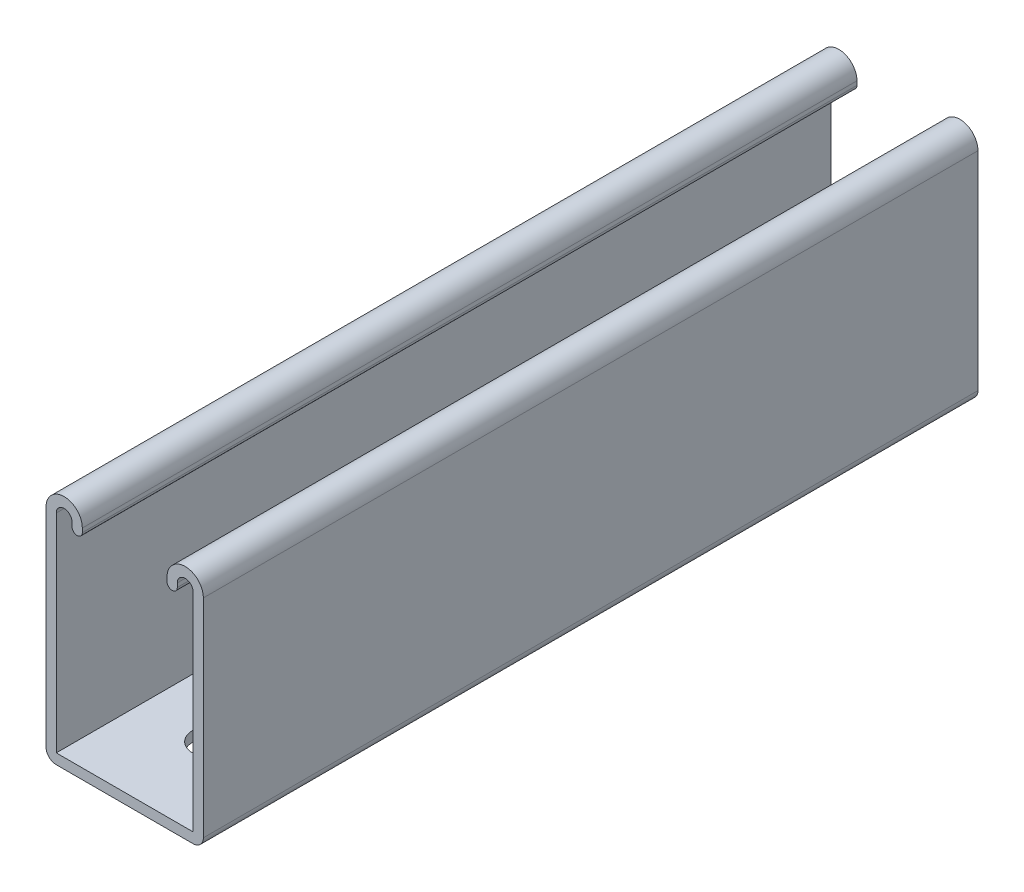
ISO-10303-21;
HEADER;
FILE_DESCRIPTION(('STEP AP214'),'2;1');
FILE_NAME('part.step','',(''),(''),'','','');
FILE_SCHEMA(('AUTOMOTIVE_DESIGN { 1 0 10303 214 1 1 1 1 }'));
ENDSEC;
DATA;
#1=APPLICATION_CONTEXT('core data for automotive mechanical design processes');
#2=APPLICATION_PROTOCOL_DEFINITION('international standard','automotive_design',2000,#1);
#3=PRODUCT_CONTEXT('',#1,'mechanical');
#4=PRODUCT('Part','Part','',(#3));
#5=PRODUCT_RELATED_PRODUCT_CATEGORY('part','',(#4));
#6=PRODUCT_DEFINITION_FORMATION('','',#4);
#7=PRODUCT_DEFINITION_CONTEXT('part definition',#1,'design');
#8=PRODUCT_DEFINITION('design','',#6,#7);
#9=PRODUCT_DEFINITION_SHAPE('','',#8);
#10=(LENGTH_UNIT() NAMED_UNIT(*) SI_UNIT(.MILLI.,.METRE.));
#11=(NAMED_UNIT(*) PLANE_ANGLE_UNIT() SI_UNIT($,.RADIAN.));
#12=(NAMED_UNIT(*) SI_UNIT($,.STERADIAN.) SOLID_ANGLE_UNIT());
#13=UNCERTAINTY_MEASURE_WITH_UNIT(LENGTH_MEASURE(1.E-05),#10,'distance_accuracy_value','');
#14=(GEOMETRIC_REPRESENTATION_CONTEXT(3) GLOBAL_UNCERTAINTY_ASSIGNED_CONTEXT((#13)) GLOBAL_UNIT_ASSIGNED_CONTEXT((#10,
#11,#12)) REPRESENTATION_CONTEXT('',''));
#15=CARTESIAN_POINT('',(0.,0.,0.));
#16=DIRECTION('',(0.,0.,1.));
#17=DIRECTION('',(1.,0.,0.));
#18=AXIS2_PLACEMENT_3D('',#15,#16,#17);
#19=CARTESIAN_POINT('',(-15.875,29.1719,203.2));
#20=DIRECTION('',(0.,0.,-1.));
#21=DIRECTION('',(-1.,0.,0.));
#22=AXIS2_PLACEMENT_3D('',#19,#20,#21);
#23=CYLINDRICAL_SURFACE('',#22,4.7625);
#24=CARTESIAN_POINT('',(-15.875,29.1719,0.));
#25=DIRECTION('',(0.,0.,1.));
#26=DIRECTION('',(-1.,0.,0.));
#27=AXIS2_PLACEMENT_3D('',#24,#25,#26);
#28=CIRCLE('',#27,4.7625);
#29=CARTESIAN_POINT('',(-11.1125,29.1719,0.));
#30=VERTEX_POINT('',#29);
#31=CARTESIAN_POINT('',(-20.6375,29.1719,0.));
#32=VERTEX_POINT('',#31);
#33=EDGE_CURVE('E253',#30,#32,#28,.T.);
#34=ORIENTED_EDGE('',*,*,#33,.T.);
#35=DIRECTION('',(0.,0.,-1.));
#36=VECTOR('',#35,1.);
#37=CARTESIAN_POINT('',(-20.6375,29.1719,203.2));
#38=LINE('',#37,#36);
#39=CARTESIAN_POINT('',(-20.6375,29.1719,203.2));
#40=VERTEX_POINT('',#39);
#41=EDGE_CURVE('E384',#40,#32,#38,.T.);
#42=ORIENTED_EDGE('',*,*,#41,.F.);
#43=CARTESIAN_POINT('',(-15.875,29.1719,203.2));
#44=DIRECTION('',(0.,0.,1.));
#45=DIRECTION('',(-1.,0.,0.));
#46=AXIS2_PLACEMENT_3D('',#43,#44,#45);
#47=CIRCLE('',#46,4.7625);
#48=CARTESIAN_POINT('',(-11.1125,29.1719,203.2));
#49=VERTEX_POINT('',#48);
#50=EDGE_CURVE('E260',#49,#40,#47,.T.);
#51=ORIENTED_EDGE('',*,*,#50,.F.);
#52=DIRECTION('',(0.,0.,-1.));
#53=VECTOR('',#52,1.);
#54=CARTESIAN_POINT('',(-11.1125,29.1719,203.2));
#55=LINE('',#54,#53);
#56=EDGE_CURVE('E298',#49,#30,#55,.T.);
#57=ORIENTED_EDGE('',*,*,#56,.T.);
#58=EDGE_LOOP('',(#34,#42,#51,#57));
#59=FACE_BOUND('',#58,.T.);
#60=ADVANCED_FACE('F32',(#59),#23,.T.);
#61=CARTESIAN_POINT('',(-20.6375,29.1719,203.2));
#62=DIRECTION('',(1.,0.,0.));
#63=DIRECTION('',(0.,1.,0.));
#64=AXIS2_PLACEMENT_3D('',#61,#62,#63);
#65=PLANE('',#64);
#66=DIRECTION('',(0.,-1.,0.));
#67=VECTOR('',#66,1.);
#68=CARTESIAN_POINT('',(-20.6375,29.1719,0.));
#69=LINE('',#68,#67);
#70=CARTESIAN_POINT('',(-20.6375,-25.3238,0.));
#71=VERTEX_POINT('',#70);
#72=EDGE_CURVE('E301',#32,#71,#69,.T.);
#73=ORIENTED_EDGE('',*,*,#72,.T.);
#74=DIRECTION('',(0.,0.,-1.));
#75=VECTOR('',#74,1.);
#76=CARTESIAN_POINT('',(-20.6375,-25.3238,203.2));
#77=LINE('',#76,#75);
#78=CARTESIAN_POINT('',(-20.6375,-25.3238,203.2));
#79=VERTEX_POINT('',#78);
#80=EDGE_CURVE('E381',#79,#71,#77,.T.);
#81=ORIENTED_EDGE('',*,*,#80,.F.);
#82=DIRECTION('',(0.,-1.,0.));
#83=VECTOR('',#82,1.);
#84=CARTESIAN_POINT('',(-20.6375,29.1719,203.2));
#85=LINE('',#84,#83);
#86=EDGE_CURVE('E263',#40,#79,#85,.T.);
#87=ORIENTED_EDGE('',*,*,#86,.F.);
#88=ORIENTED_EDGE('',*,*,#41,.T.);
#89=EDGE_LOOP('',(#73,#81,#87,#88));
#90=FACE_BOUND('',#89,.T.);
#91=ADVANCED_FACE('F425',(#90),#65,.F.);
#92=CARTESIAN_POINT('',(-17.9451,-25.3238,203.2));
#93=DIRECTION('',(0.,0.,-1.));
#94=DIRECTION('',(-1.,0.,0.));
#95=AXIS2_PLACEMENT_3D('',#92,#93,#94);
#96=CYLINDRICAL_SURFACE('',#95,2.6924);
#97=CARTESIAN_POINT('',(-17.9451,-25.3238,0.));
#98=DIRECTION('',(0.,0.,1.));
#99=DIRECTION('',(-1.,0.,0.));
#100=AXIS2_PLACEMENT_3D('',#97,#98,#99);
#101=CIRCLE('',#100,2.6924);
#102=CARTESIAN_POINT('',(-17.9451,-28.0162,0.));
#103=VERTEX_POINT('',#102);
#104=EDGE_CURVE('E303',#71,#103,#101,.T.);
#105=ORIENTED_EDGE('',*,*,#104,.T.);
#106=DIRECTION('',(0.,0.,-1.));
#107=VECTOR('',#106,1.);
#108=CARTESIAN_POINT('',(-17.9451,-28.0162,203.2));
#109=LINE('',#108,#107);
#110=CARTESIAN_POINT('',(-17.9451,-28.0162,203.2));
#111=VERTEX_POINT('',#110);
#112=EDGE_CURVE('E378',#111,#103,#109,.T.);
#113=ORIENTED_EDGE('',*,*,#112,.F.);
#114=CARTESIAN_POINT('',(-17.9451,-25.3238,203.2));
#115=DIRECTION('',(0.,0.,1.));
#116=DIRECTION('',(-1.,0.,0.));
#117=AXIS2_PLACEMENT_3D('',#114,#115,#116);
#118=CIRCLE('',#117,2.6924);
#119=EDGE_CURVE('E266',#79,#111,#118,.T.);
#120=ORIENTED_EDGE('',*,*,#119,.F.);
#121=ORIENTED_EDGE('',*,*,#80,.T.);
#122=EDGE_LOOP('',(#105,#113,#120,#121));
#123=FACE_BOUND('',#122,.T.);
#124=ADVANCED_FACE('F430',(#123),#96,.T.);
#125=CARTESIAN_POINT('',(-17.9451,-28.0162,203.2));
#126=DIRECTION('',(0.,1.,0.));
#127=DIRECTION('',(-1.,0.,0.));
#128=AXIS2_PLACEMENT_3D('',#125,#126,#127);
#129=PLANE('',#128);
#130=DIRECTION('',(0.,0.,-1.));
#131=VECTOR('',#130,1.);
#132=CARTESIAN_POINT('',(-5.159375,-28.0162000000246,114.3));
#133=LINE('',#132,#131);
#134=CARTESIAN_POINT('',(-5.159375,-28.0162,180.18125));
#135=VERTEX_POINT('',#134);
#136=CARTESIAN_POINT('',(-5.159375,-28.0162000000246,114.3));
#137=VERTEX_POINT('',#136);
#138=EDGE_CURVE('E206',#135,#137,#133,.T.);
#139=ORIENTED_EDGE('',*,*,#138,.F.);
#140=CARTESIAN_POINT('',(0.,-28.0162000000246,180.18125));
#141=DIRECTION('',(0.,-1.,0.));
#142=DIRECTION('',(1.,0.,0.));
#143=AXIS2_PLACEMENT_3D('',#140,#141,#142);
#144=CIRCLE('',#143,5.159375);
#145=CARTESIAN_POINT('',(5.159375,-28.0162000000246,180.18125));
#146=VERTEX_POINT('',#145);
#147=EDGE_CURVE('E46',#146,#135,#144,.T.);
#148=ORIENTED_EDGE('',*,*,#147,.F.);
#149=DIRECTION('',(0.,0.,1.));
#150=VECTOR('',#149,1.);
#151=CARTESIAN_POINT('',(5.159375,-28.0162000000246,180.18125));
#152=LINE('',#151,#150);
#153=CARTESIAN_POINT('',(5.15937500000001,-28.0162000000246,114.3));
#154=VERTEX_POINT('',#153);
#155=EDGE_CURVE('E222',#154,#146,#152,.T.);
#156=ORIENTED_EDGE('',*,*,#155,.F.);
#157=CARTESIAN_POINT('',(0.,-28.0162000000246,114.3));
#158=DIRECTION('',(0.,-1.,0.));
#159=DIRECTION('',(1.,0.,0.));
#160=AXIS2_PLACEMENT_3D('',#157,#158,#159);
#161=CIRCLE('',#160,5.159375);
#162=EDGE_CURVE('E216',#137,#154,#161,.T.);
#163=ORIENTED_EDGE('',*,*,#162,.F.);
#164=EDGE_LOOP('',(#139,#148,#156,#163));
#165=FACE_BOUND('',#164,.T.);
#166=DIRECTION('',(0.,0.,-1.));
#167=VECTOR('',#166,1.);
#168=CARTESIAN_POINT('',(-5.159375,-28.0162000000246,12.7));
#169=LINE('',#168,#167);
#170=CARTESIAN_POINT('',(-5.15937500000001,-28.0162,78.58125));
#171=VERTEX_POINT('',#170);
#172=CARTESIAN_POINT('',(-5.159375,-28.0162000000246,12.7));
#173=VERTEX_POINT('',#172);
#174=EDGE_CURVE('E241',#171,#173,#169,.T.);
#175=ORIENTED_EDGE('',*,*,#174,.F.);
#176=CARTESIAN_POINT('',(0.,-28.0162000000246,78.58125));
#177=DIRECTION('',(0.,-1.,0.));
#178=DIRECTION('',(1.,0.,0.));
#179=AXIS2_PLACEMENT_3D('',#176,#177,#178);
#180=CIRCLE('',#179,5.159375);
#181=CARTESIAN_POINT('',(5.159375,-28.0162000000246,78.58125));
#182=VERTEX_POINT('',#181);
#183=EDGE_CURVE('E239',#182,#171,#180,.T.);
#184=ORIENTED_EDGE('',*,*,#183,.F.);
#185=DIRECTION('',(0.,0.,1.));
#186=VECTOR('',#185,1.);
#187=CARTESIAN_POINT('',(5.159375,-28.0162000000246,78.58125));
#188=LINE('',#187,#186);
#189=CARTESIAN_POINT('',(5.15937500000001,-28.0162000000246,12.7));
#190=VERTEX_POINT('',#189);
#191=EDGE_CURVE('E247',#190,#182,#188,.T.);
#192=ORIENTED_EDGE('',*,*,#191,.F.);
#193=CARTESIAN_POINT('',(0.,-28.0162000000246,12.7));
#194=DIRECTION('',(0.,-1.,0.));
#195=DIRECTION('',(1.,0.,0.));
#196=AXIS2_PLACEMENT_3D('',#193,#194,#195);
#197=CIRCLE('',#196,5.159375);
#198=EDGE_CURVE('E244',#173,#190,#197,.T.);
#199=ORIENTED_EDGE('',*,*,#198,.F.);
#200=EDGE_LOOP('',(#175,#184,#192,#199));
#201=FACE_BOUND('',#200,.T.);
#202=DIRECTION('',(1.,0.,0.));
#203=VECTOR('',#202,1.);
#204=CARTESIAN_POINT('',(-17.9451,-28.0162,0.));
#205=LINE('',#204,#203);
#206=CARTESIAN_POINT('',(17.9451,-28.0162,0.));
#207=VERTEX_POINT('',#206);
#208=EDGE_CURVE('E305',#103,#207,#205,.T.);
#209=ORIENTED_EDGE('',*,*,#208,.T.);
#210=DIRECTION('',(0.,0.,-1.));
#211=VECTOR('',#210,1.);
#212=CARTESIAN_POINT('',(17.9451,-28.0162,203.2));
#213=LINE('',#212,#211);
#214=CARTESIAN_POINT('',(17.9451,-28.0162,203.2));
#215=VERTEX_POINT('',#214);
#216=EDGE_CURVE('E375',#215,#207,#213,.T.);
#217=ORIENTED_EDGE('',*,*,#216,.F.);
#218=DIRECTION('',(1.,0.,0.));
#219=VECTOR('',#218,1.);
#220=CARTESIAN_POINT('',(-17.9451,-28.0162,203.2));
#221=LINE('',#220,#219);
#222=EDGE_CURVE('E268',#111,#215,#221,.T.);
#223=ORIENTED_EDGE('',*,*,#222,.F.);
#224=ORIENTED_EDGE('',*,*,#112,.T.);
#225=EDGE_LOOP('',(#209,#217,#223,#224));
#226=FACE_BOUND('',#225,.T.);
#227=ADVANCED_FACE('F220',(#165,#201,#226),#129,.F.);
#228=CARTESIAN_POINT('',(17.9451,-25.3238,203.2));
#229=DIRECTION('',(0.,0.,-1.));
#230=DIRECTION('',(-1.,0.,0.));
#231=AXIS2_PLACEMENT_3D('',#228,#229,#230);
#232=CYLINDRICAL_SURFACE('',#231,2.6924);
#233=CARTESIAN_POINT('',(17.9451,-25.3238,0.));
#234=DIRECTION('',(0.,0.,1.));
#235=DIRECTION('',(1.,0.,0.));
#236=AXIS2_PLACEMENT_3D('',#233,#234,#235);
#237=CIRCLE('',#236,2.6924);
#238=CARTESIAN_POINT('',(20.6375,-25.3238,0.));
#239=VERTEX_POINT('',#238);
#240=EDGE_CURVE('E307',#207,#239,#237,.T.);
#241=ORIENTED_EDGE('',*,*,#240,.T.);
#242=DIRECTION('',(0.,0.,-1.));
#243=VECTOR('',#242,1.);
#244=CARTESIAN_POINT('',(20.6375,-25.3238,203.2));
#245=LINE('',#244,#243);
#246=CARTESIAN_POINT('',(20.6375,-25.3238,203.2));
#247=VERTEX_POINT('',#246);
#248=EDGE_CURVE('E372',#247,#239,#245,.T.);
#249=ORIENTED_EDGE('',*,*,#248,.F.);
#250=CARTESIAN_POINT('',(17.9451,-25.3238,203.2));
#251=DIRECTION('',(0.,0.,1.));
#252=DIRECTION('',(1.,0.,0.));
#253=AXIS2_PLACEMENT_3D('',#250,#251,#252);
#254=CIRCLE('',#253,2.6924);
#255=EDGE_CURVE('E270',#215,#247,#254,.T.);
#256=ORIENTED_EDGE('',*,*,#255,.F.);
#257=ORIENTED_EDGE('',*,*,#216,.T.);
#258=EDGE_LOOP('',(#241,#249,#256,#257));
#259=FACE_BOUND('',#258,.T.);
#260=ADVANCED_FACE('F510',(#259),#232,.T.);
#261=CARTESIAN_POINT('',(20.6375,-25.3238,203.2));
#262=DIRECTION('',(-1.,0.,0.));
#263=DIRECTION('',(0.,-1.,0.));
#264=AXIS2_PLACEMENT_3D('',#261,#262,#263);
#265=PLANE('',#264);
#266=DIRECTION('',(0.,1.,0.));
#267=VECTOR('',#266,1.);
#268=CARTESIAN_POINT('',(20.6375,-25.3238,0.));
#269=LINE('',#268,#267);
#270=CARTESIAN_POINT('',(20.6375,29.1719,0.));
#271=VERTEX_POINT('',#270);
#272=EDGE_CURVE('E309',#239,#271,#269,.T.);
#273=ORIENTED_EDGE('',*,*,#272,.T.);
#274=DIRECTION('',(0.,0.,-1.));
#275=VECTOR('',#274,1.);
#276=CARTESIAN_POINT('',(20.6375,29.1719,203.2));
#277=LINE('',#276,#275);
#278=CARTESIAN_POINT('',(20.6375,29.1719,203.2));
#279=VERTEX_POINT('',#278);
#280=EDGE_CURVE('E369',#279,#271,#277,.T.);
#281=ORIENTED_EDGE('',*,*,#280,.F.);
#282=DIRECTION('',(0.,1.,0.));
#283=VECTOR('',#282,1.);
#284=CARTESIAN_POINT('',(20.6375,-25.3238,203.2));
#285=LINE('',#284,#283);
#286=EDGE_CURVE('E272',#247,#279,#285,.T.);
#287=ORIENTED_EDGE('',*,*,#286,.F.);
#288=ORIENTED_EDGE('',*,*,#248,.T.);
#289=EDGE_LOOP('',(#273,#281,#287,#288));
#290=FACE_BOUND('',#289,.T.);
#291=ADVANCED_FACE('F506',(#290),#265,.F.);
#292=CARTESIAN_POINT('',(15.875,29.1719,203.2));
#293=DIRECTION('',(0.,0.,-1.));
#294=DIRECTION('',(-1.,0.,0.));
#295=AXIS2_PLACEMENT_3D('',#292,#293,#294);
#296=CYLINDRICAL_SURFACE('',#295,4.7625);
#297=CARTESIAN_POINT('',(15.875,29.1719,0.));
#298=DIRECTION('',(0.,0.,1.));
#299=DIRECTION('',(1.,0.,0.));
#300=AXIS2_PLACEMENT_3D('',#297,#298,#299);
#301=CIRCLE('',#300,4.7625);
#302=CARTESIAN_POINT('',(11.1125,29.1719,0.));
#303=VERTEX_POINT('',#302);
#304=EDGE_CURVE('E311',#271,#303,#301,.T.);
#305=ORIENTED_EDGE('',*,*,#304,.T.);
#306=DIRECTION('',(0.,0.,-1.));
#307=VECTOR('',#306,1.);
#308=CARTESIAN_POINT('',(11.1125,29.1719,203.2));
#309=LINE('',#308,#307);
#310=CARTESIAN_POINT('',(11.1125,29.1719,203.2));
#311=VERTEX_POINT('',#310);
#312=EDGE_CURVE('E366',#311,#303,#309,.T.);
#313=ORIENTED_EDGE('',*,*,#312,.F.);
#314=CARTESIAN_POINT('',(15.875,29.1719,203.2));
#315=DIRECTION('',(0.,0.,1.));
#316=DIRECTION('',(1.,0.,0.));
#317=AXIS2_PLACEMENT_3D('',#314,#315,#316);
#318=CIRCLE('',#317,4.7625);
#319=EDGE_CURVE('E274',#279,#311,#318,.T.);
#320=ORIENTED_EDGE('',*,*,#319,.F.);
#321=ORIENTED_EDGE('',*,*,#280,.T.);
#322=EDGE_LOOP('',(#305,#313,#320,#321));
#323=FACE_BOUND('',#322,.T.);
#324=ADVANCED_FACE('F501',(#323),#296,.T.);
#325=CARTESIAN_POINT('',(11.1125,29.1719,203.2));
#326=DIRECTION('',(1.,0.,0.));
#327=DIRECTION('',(0.,1.,0.));
#328=AXIS2_PLACEMENT_3D('',#325,#326,#327);
#329=PLANE('',#328);
#330=DIRECTION('',(0.,-1.,0.));
#331=VECTOR('',#330,1.);
#332=CARTESIAN_POINT('',(11.1125,29.1719,0.));
#333=LINE('',#332,#331);
#334=CARTESIAN_POINT('',(11.1125,28.13685,0.));
#335=VERTEX_POINT('',#334);
#336=EDGE_CURVE('E313',#303,#335,#333,.T.);
#337=ORIENTED_EDGE('',*,*,#336,.T.);
#338=DIRECTION('',(0.,0.,-1.));
#339=VECTOR('',#338,1.);
#340=CARTESIAN_POINT('',(11.1125,28.13685,203.2));
#341=LINE('',#340,#339);
#342=CARTESIAN_POINT('',(11.1125,28.13685,203.2));
#343=VERTEX_POINT('',#342);
#344=EDGE_CURVE('E363',#343,#335,#341,.T.);
#345=ORIENTED_EDGE('',*,*,#344,.F.);
#346=DIRECTION('',(0.,-1.,0.));
#347=VECTOR('',#346,1.);
#348=CARTESIAN_POINT('',(11.1125,29.1719,203.2));
#349=LINE('',#348,#347);
#350=EDGE_CURVE('E276',#311,#343,#349,.T.);
#351=ORIENTED_EDGE('',*,*,#350,.F.);
#352=ORIENTED_EDGE('',*,*,#312,.T.);
#353=EDGE_LOOP('',(#337,#345,#351,#352));
#354=FACE_BOUND('',#353,.T.);
#355=ADVANCED_FACE('F495',(#354),#329,.F.);
#356=CARTESIAN_POINT('',(12.4587,28.13685,203.2));
#357=DIRECTION('',(0.,0.,-1.));
#358=DIRECTION('',(-1.,0.,0.));
#359=AXIS2_PLACEMENT_3D('',#356,#357,#358);
#360=CYLINDRICAL_SURFACE('',#359,1.3462);
#361=CARTESIAN_POINT('',(12.4587,28.13685,0.));
#362=DIRECTION('',(0.,0.,1.));
#363=DIRECTION('',(1.,0.,0.));
#364=AXIS2_PLACEMENT_3D('',#361,#362,#363);
#365=CIRCLE('',#364,1.3462);
#366=CARTESIAN_POINT('',(13.8049,28.13685,0.));
#367=VERTEX_POINT('',#366);
#368=EDGE_CURVE('E315',#335,#367,#365,.T.);
#369=ORIENTED_EDGE('',*,*,#368,.T.);
#370=DIRECTION('',(0.,0.,-1.));
#371=VECTOR('',#370,1.);
#372=CARTESIAN_POINT('',(13.8049,28.13685,203.2));
#373=LINE('',#372,#371);
#374=CARTESIAN_POINT('',(13.8049,28.13685,203.2));
#375=VERTEX_POINT('',#374);
#376=EDGE_CURVE('E360',#375,#367,#373,.T.);
#377=ORIENTED_EDGE('',*,*,#376,.F.);
#378=CARTESIAN_POINT('',(12.4587,28.13685,203.2));
#379=DIRECTION('',(0.,0.,1.));
#380=DIRECTION('',(1.,0.,0.));
#381=AXIS2_PLACEMENT_3D('',#378,#379,#380);
#382=CIRCLE('',#381,1.3462);
#383=EDGE_CURVE('E278',#343,#375,#382,.T.);
#384=ORIENTED_EDGE('',*,*,#383,.F.);
#385=ORIENTED_EDGE('',*,*,#344,.T.);
#386=EDGE_LOOP('',(#369,#377,#384,#385));
#387=FACE_BOUND('',#386,.T.);
#388=ADVANCED_FACE('F491',(#387),#360,.T.);
#389=CARTESIAN_POINT('',(13.8049,29.1719,203.2));
#390=DIRECTION('',(-1.,0.,0.));
#391=DIRECTION('',(0.,0.,1.));
#392=AXIS2_PLACEMENT_3D('',#389,#390,#391);
#393=PLANE('',#392);
#394=DIRECTION('',(0.,1.,0.));
#395=VECTOR('',#394,1.);
#396=CARTESIAN_POINT('',(13.8049,29.1719,0.));
#397=LINE('',#396,#395);
#398=CARTESIAN_POINT('',(13.8049,29.1719,0.));
#399=VERTEX_POINT('',#398);
#400=EDGE_CURVE('E317',#367,#399,#397,.T.);
#401=ORIENTED_EDGE('',*,*,#400,.T.);
#402=DIRECTION('',(0.,0.,-1.));
#403=VECTOR('',#402,1.);
#404=CARTESIAN_POINT('',(13.8049,29.1719,203.2));
#405=LINE('',#404,#403);
#406=CARTESIAN_POINT('',(13.8049,29.1719,203.2));
#407=VERTEX_POINT('',#406);
#408=EDGE_CURVE('E357',#407,#399,#405,.T.);
#409=ORIENTED_EDGE('',*,*,#408,.F.);
#410=DIRECTION('',(0.,1.,0.));
#411=VECTOR('',#410,1.);
#412=CARTESIAN_POINT('',(13.8049,29.1719,203.2));
#413=LINE('',#412,#411);
#414=EDGE_CURVE('E280',#375,#407,#413,.T.);
#415=ORIENTED_EDGE('',*,*,#414,.F.);
#416=ORIENTED_EDGE('',*,*,#376,.T.);
#417=EDGE_LOOP('',(#401,#409,#415,#416));
#418=FACE_BOUND('',#417,.T.);
#419=ADVANCED_FACE('F486',(#418),#393,.F.);
#420=CARTESIAN_POINT('',(15.875,29.1719,203.2));
#421=DIRECTION('',(0.,0.,-1.));
#422=DIRECTION('',(-1.,0.,0.));
#423=AXIS2_PLACEMENT_3D('',#420,#421,#422);
#424=CYLINDRICAL_SURFACE('',#423,2.0701);
#425=CARTESIAN_POINT('',(15.875,29.1719,0.));
#426=DIRECTION('',(0.,0.,-1.));
#427=DIRECTION('',(1.,0.,0.));
#428=AXIS2_PLACEMENT_3D('',#425,#426,#427);
#429=CIRCLE('',#428,2.0701);
#430=CARTESIAN_POINT('',(17.9451,29.1719,0.));
#431=VERTEX_POINT('',#430);
#432=EDGE_CURVE('E319',#399,#431,#429,.T.);
#433=ORIENTED_EDGE('',*,*,#432,.T.);
#434=DIRECTION('',(0.,0.,-1.));
#435=VECTOR('',#434,1.);
#436=CARTESIAN_POINT('',(17.9451,29.1719,203.2));
#437=LINE('',#436,#435);
#438=CARTESIAN_POINT('',(17.9451,29.1719,203.2));
#439=VERTEX_POINT('',#438);
#440=EDGE_CURVE('E354',#439,#431,#437,.T.);
#441=ORIENTED_EDGE('',*,*,#440,.F.);
#442=CARTESIAN_POINT('',(15.875,29.1719,203.2));
#443=DIRECTION('',(0.,0.,-1.));
#444=DIRECTION('',(1.,0.,0.));
#445=AXIS2_PLACEMENT_3D('',#442,#443,#444);
#446=CIRCLE('',#445,2.0701);
#447=EDGE_CURVE('E282',#407,#439,#446,.T.);
#448=ORIENTED_EDGE('',*,*,#447,.F.);
#449=ORIENTED_EDGE('',*,*,#408,.T.);
#450=EDGE_LOOP('',(#433,#441,#448,#449));
#451=FACE_BOUND('',#450,.T.);
#452=ADVANCED_FACE('F480',(#451),#424,.F.);
#453=CARTESIAN_POINT('',(17.9451,-25.3238,203.2));
#454=DIRECTION('',(1.,0.,0.));
#455=DIRECTION('',(0.,0.,-1.));
#456=AXIS2_PLACEMENT_3D('',#453,#454,#455);
#457=PLANE('',#456);
#458=DIRECTION('',(0.,-1.,0.));
#459=VECTOR('',#458,1.);
#460=CARTESIAN_POINT('',(17.9451,-25.3238,0.));
#461=LINE('',#460,#459);
#462=CARTESIAN_POINT('',(17.9451,-25.3238,0.));
#463=VERTEX_POINT('',#462);
#464=EDGE_CURVE('E321',#431,#463,#461,.T.);
#465=ORIENTED_EDGE('',*,*,#464,.T.);
#466=DIRECTION('',(0.,0.,-1.));
#467=VECTOR('',#466,1.);
#468=CARTESIAN_POINT('',(17.9451,-25.3238,203.2));
#469=LINE('',#468,#467);
#470=CARTESIAN_POINT('',(17.9451,-25.3238,203.2));
#471=VERTEX_POINT('',#470);
#472=EDGE_CURVE('E351',#471,#463,#469,.T.);
#473=ORIENTED_EDGE('',*,*,#472,.F.);
#474=DIRECTION('',(0.,-1.,0.));
#475=VECTOR('',#474,1.);
#476=CARTESIAN_POINT('',(17.9451,-25.3238,203.2));
#477=LINE('',#476,#475);
#478=EDGE_CURVE('E284',#439,#471,#477,.T.);
#479=ORIENTED_EDGE('',*,*,#478,.F.);
#480=ORIENTED_EDGE('',*,*,#440,.T.);
#481=EDGE_LOOP('',(#465,#473,#479,#480));
#482=FACE_BOUND('',#481,.T.);
#483=ADVANCED_FACE('F476',(#482),#457,.F.);
#484=CARTESIAN_POINT('',(-17.9451,-25.3238,203.2));
#485=DIRECTION('',(0.,-1.,0.));
#486=DIRECTION('',(0.,0.,-1.));
#487=AXIS2_PLACEMENT_3D('',#484,#485,#486);
#488=PLANE('',#487);
#489=DIRECTION('',(0.,0.,1.));
#490=VECTOR('',#489,1.);
#491=CARTESIAN_POINT('',(5.159375,-25.3238,304.8));
#492=LINE('',#491,#490);
#493=CARTESIAN_POINT('',(5.15937500000001,-25.3238,114.3));
#494=VERTEX_POINT('',#493);
#495=CARTESIAN_POINT('',(5.159375,-25.3238,180.18125));
#496=VERTEX_POINT('',#495);
#497=EDGE_CURVE('E232',#494,#496,#492,.T.);
#498=ORIENTED_EDGE('',*,*,#497,.T.);
#499=CARTESIAN_POINT('',(0.,-25.3238,180.18125));
#500=DIRECTION('',(0.,-1.,0.));
#501=DIRECTION('',(0.,0.,-1.));
#502=AXIS2_PLACEMENT_3D('',#499,#500,#501);
#503=CIRCLE('',#502,5.159375);
#504=CARTESIAN_POINT('',(-5.159375,-25.3238,180.18125));
#505=VERTEX_POINT('',#504);
#506=EDGE_CURVE('E236',#496,#505,#503,.T.);
#507=ORIENTED_EDGE('',*,*,#506,.T.);
#508=DIRECTION('',(0.,0.,-1.));
#509=VECTOR('',#508,1.);
#510=CARTESIAN_POINT('',(-5.15937500000001,-25.3238,304.8));
#511=LINE('',#510,#509);
#512=CARTESIAN_POINT('',(-5.159375,-25.3238,114.3));
#513=VERTEX_POINT('',#512);
#514=EDGE_CURVE('E213',#505,#513,#511,.T.);
#515=ORIENTED_EDGE('',*,*,#514,.T.);
#516=CARTESIAN_POINT('',(0.,-25.3238,114.3));
#517=DIRECTION('',(0.,-1.,0.));
#518=DIRECTION('',(0.,0.,-1.));
#519=AXIS2_PLACEMENT_3D('',#516,#517,#518);
#520=CIRCLE('',#519,5.159375);
#521=EDGE_CURVE('E54',#513,#494,#520,.T.);
#522=ORIENTED_EDGE('',*,*,#521,.T.);
#523=EDGE_LOOP('',(#498,#507,#515,#522));
#524=FACE_BOUND('',#523,.T.);
#525=DIRECTION('',(0.,0.,1.));
#526=VECTOR('',#525,1.);
#527=CARTESIAN_POINT('',(5.159375,-25.3238,203.2));
#528=LINE('',#527,#526);
#529=CARTESIAN_POINT('',(5.15937500000001,-25.3238,12.7));
#530=VERTEX_POINT('',#529);
#531=CARTESIAN_POINT('',(5.159375,-25.3238,78.58125));
#532=VERTEX_POINT('',#531);
#533=EDGE_CURVE('E39',#530,#532,#528,.T.);
#534=ORIENTED_EDGE('',*,*,#533,.T.);
#535=CARTESIAN_POINT('',(0.,-25.3238,78.58125));
#536=DIRECTION('',(0.,-1.,0.));
#537=DIRECTION('',(0.,0.,-1.));
#538=AXIS2_PLACEMENT_3D('',#535,#536,#537);
#539=CIRCLE('',#538,5.159375);
#540=CARTESIAN_POINT('',(-5.159375,-25.3238,78.58125));
#541=VERTEX_POINT('',#540);
#542=EDGE_CURVE('E11',#532,#541,#539,.T.);
#543=ORIENTED_EDGE('',*,*,#542,.T.);
#544=DIRECTION('',(0.,0.,-1.));
#545=VECTOR('',#544,1.);
#546=CARTESIAN_POINT('',(-5.15937500000001,-25.3238,203.2));
#547=LINE('',#546,#545);
#548=CARTESIAN_POINT('',(-5.159375,-25.3238,12.7));
#549=VERTEX_POINT('',#548);
#550=EDGE_CURVE('E387',#541,#549,#547,.T.);
#551=ORIENTED_EDGE('',*,*,#550,.T.);
#552=CARTESIAN_POINT('',(0.,-25.3238,12.7));
#553=DIRECTION('',(0.,-1.,0.));
#554=DIRECTION('',(0.,0.,-1.));
#555=AXIS2_PLACEMENT_3D('',#552,#553,#554);
#556=CIRCLE('',#555,5.159375);
#557=EDGE_CURVE('E390',#549,#530,#556,.T.);
#558=ORIENTED_EDGE('',*,*,#557,.T.);
#559=EDGE_LOOP('',(#534,#543,#551,#558));
#560=FACE_BOUND('',#559,.T.);
#561=DIRECTION('',(-1.,0.,0.));
#562=VECTOR('',#561,1.);
#563=CARTESIAN_POINT('',(-17.9451,-25.3238,0.));
#564=LINE('',#563,#562);
#565=CARTESIAN_POINT('',(-17.9451,-25.3238,0.));
#566=VERTEX_POINT('',#565);
#567=EDGE_CURVE('E323',#463,#566,#564,.T.);
#568=ORIENTED_EDGE('',*,*,#567,.T.);
#569=DIRECTION('',(0.,0.,-1.));
#570=VECTOR('',#569,1.);
#571=CARTESIAN_POINT('',(-17.9451,-25.3238,203.2));
#572=LINE('',#571,#570);
#573=CARTESIAN_POINT('',(-17.9451,-25.3238,203.2));
#574=VERTEX_POINT('',#573);
#575=EDGE_CURVE('E348',#574,#566,#572,.T.);
#576=ORIENTED_EDGE('',*,*,#575,.F.);
#577=DIRECTION('',(-1.,0.,0.));
#578=VECTOR('',#577,1.);
#579=CARTESIAN_POINT('',(-17.9451,-25.3238,203.2));
#580=LINE('',#579,#578);
#581=EDGE_CURVE('E286',#471,#574,#580,.T.);
#582=ORIENTED_EDGE('',*,*,#581,.F.);
#583=ORIENTED_EDGE('',*,*,#472,.T.);
#584=EDGE_LOOP('',(#568,#576,#582,#583));
#585=FACE_BOUND('',#584,.T.);
#586=ADVANCED_FACE('F394',(#524,#560,#585),#488,.F.);
#587=CARTESIAN_POINT('',(-17.9451,29.1719,203.2));
#588=DIRECTION('',(-1.,0.,0.));
#589=DIRECTION('',(0.,-1.,0.));
#590=AXIS2_PLACEMENT_3D('',#587,#588,#589);
#591=PLANE('',#590);
#592=DIRECTION('',(0.,1.,0.));
#593=VECTOR('',#592,1.);
#594=CARTESIAN_POINT('',(-17.9451,29.1719,0.));
#595=LINE('',#594,#593);
#596=CARTESIAN_POINT('',(-17.9451,29.1719,0.));
#597=VERTEX_POINT('',#596);
#598=EDGE_CURVE('E325',#566,#597,#595,.T.);
#599=ORIENTED_EDGE('',*,*,#598,.T.);
#600=DIRECTION('',(0.,0.,-1.));
#601=VECTOR('',#600,1.);
#602=CARTESIAN_POINT('',(-17.9451,29.1719,203.2));
#603=LINE('',#602,#601);
#604=CARTESIAN_POINT('',(-17.9451,29.1719,203.2));
#605=VERTEX_POINT('',#604);
#606=EDGE_CURVE('E345',#605,#597,#603,.T.);
#607=ORIENTED_EDGE('',*,*,#606,.F.);
#608=DIRECTION('',(0.,1.,0.));
#609=VECTOR('',#608,1.);
#610=CARTESIAN_POINT('',(-17.9451,29.1719,203.2));
#611=LINE('',#610,#609);
#612=EDGE_CURVE('E288',#574,#605,#611,.T.);
#613=ORIENTED_EDGE('',*,*,#612,.F.);
#614=ORIENTED_EDGE('',*,*,#575,.T.);
#615=EDGE_LOOP('',(#599,#607,#613,#614));
#616=FACE_BOUND('',#615,.T.);
#617=ADVANCED_FACE('F467',(#616),#591,.F.);
#618=CARTESIAN_POINT('',(-15.875,29.1719,203.2));
#619=DIRECTION('',(0.,0.,-1.));
#620=DIRECTION('',(-1.,0.,0.));
#621=AXIS2_PLACEMENT_3D('',#618,#619,#620);
#622=CYLINDRICAL_SURFACE('',#621,2.0701);
#623=CARTESIAN_POINT('',(-15.875,29.1719,0.));
#624=DIRECTION('',(0.,0.,-1.));
#625=DIRECTION('',(-1.,0.,0.));
#626=AXIS2_PLACEMENT_3D('',#623,#624,#625);
#627=CIRCLE('',#626,2.0701);
#628=CARTESIAN_POINT('',(-13.8049,29.1719,0.));
#629=VERTEX_POINT('',#628);
#630=EDGE_CURVE('E327',#597,#629,#627,.T.);
#631=ORIENTED_EDGE('',*,*,#630,.T.);
#632=DIRECTION('',(0.,0.,-1.));
#633=VECTOR('',#632,1.);
#634=CARTESIAN_POINT('',(-13.8049,29.1719,203.2));
#635=LINE('',#634,#633);
#636=CARTESIAN_POINT('',(-13.8049,29.1719,203.2));
#637=VERTEX_POINT('',#636);
#638=EDGE_CURVE('E342',#637,#629,#635,.T.);
#639=ORIENTED_EDGE('',*,*,#638,.F.);
#640=CARTESIAN_POINT('',(-15.875,29.1719,203.2));
#641=DIRECTION('',(0.,0.,-1.));
#642=DIRECTION('',(-1.,0.,0.));
#643=AXIS2_PLACEMENT_3D('',#640,#641,#642);
#644=CIRCLE('',#643,2.0701);
#645=EDGE_CURVE('E290',#605,#637,#644,.T.);
#646=ORIENTED_EDGE('',*,*,#645,.F.);
#647=ORIENTED_EDGE('',*,*,#606,.T.);
#648=EDGE_LOOP('',(#631,#639,#646,#647));
#649=FACE_BOUND('',#648,.T.);
#650=ADVANCED_FACE('F463',(#649),#622,.F.);
#651=CARTESIAN_POINT('',(-13.8049,29.1719,203.2));
#652=DIRECTION('',(1.,0.,0.));
#653=DIRECTION('',(0.,0.,-1.));
#654=AXIS2_PLACEMENT_3D('',#651,#652,#653);
#655=PLANE('',#654);
#656=DIRECTION('',(0.,-1.,0.));
#657=VECTOR('',#656,1.);
#658=CARTESIAN_POINT('',(-13.8049,29.1719,0.));
#659=LINE('',#658,#657);
#660=CARTESIAN_POINT('',(-13.8049,28.13685,0.));
#661=VERTEX_POINT('',#660);
#662=EDGE_CURVE('E329',#629,#661,#659,.T.);
#663=ORIENTED_EDGE('',*,*,#662,.T.);
#664=DIRECTION('',(0.,0.,-1.));
#665=VECTOR('',#664,1.);
#666=CARTESIAN_POINT('',(-13.8049,28.13685,203.2));
#667=LINE('',#666,#665);
#668=CARTESIAN_POINT('',(-13.8049,28.13685,203.2));
#669=VERTEX_POINT('',#668);
#670=EDGE_CURVE('E339',#669,#661,#667,.T.);
#671=ORIENTED_EDGE('',*,*,#670,.F.);
#672=DIRECTION('',(0.,-1.,0.));
#673=VECTOR('',#672,1.);
#674=CARTESIAN_POINT('',(-13.8049,29.1719,203.2));
#675=LINE('',#674,#673);
#676=EDGE_CURVE('E292',#637,#669,#675,.T.);
#677=ORIENTED_EDGE('',*,*,#676,.F.);
#678=ORIENTED_EDGE('',*,*,#638,.T.);
#679=EDGE_LOOP('',(#663,#671,#677,#678));
#680=FACE_BOUND('',#679,.T.);
#681=ADVANCED_FACE('F458',(#680),#655,.F.);
#682=CARTESIAN_POINT('',(-12.4587,28.13685,203.2));
#683=DIRECTION('',(0.,0.,-1.));
#684=DIRECTION('',(-1.,0.,0.));
#685=AXIS2_PLACEMENT_3D('',#682,#683,#684);
#686=CYLINDRICAL_SURFACE('',#685,1.3462);
#687=CARTESIAN_POINT('',(-12.4587,28.13685,0.));
#688=DIRECTION('',(0.,0.,1.));
#689=DIRECTION('',(-1.,0.,0.));
#690=AXIS2_PLACEMENT_3D('',#687,#688,#689);
#691=CIRCLE('',#690,1.3462);
#692=CARTESIAN_POINT('',(-11.1125,28.13685,0.));
#693=VERTEX_POINT('',#692);
#694=EDGE_CURVE('E331',#661,#693,#691,.T.);
#695=ORIENTED_EDGE('',*,*,#694,.T.);
#696=DIRECTION('',(0.,0.,-1.));
#697=VECTOR('',#696,1.);
#698=CARTESIAN_POINT('',(-11.1125,28.13685,203.2));
#699=LINE('',#698,#697);
#700=CARTESIAN_POINT('',(-11.1125,28.13685,203.2));
#701=VERTEX_POINT('',#700);
#702=EDGE_CURVE('E336',#701,#693,#699,.T.);
#703=ORIENTED_EDGE('',*,*,#702,.F.);
#704=CARTESIAN_POINT('',(-12.4587,28.13685,203.2));
#705=DIRECTION('',(0.,0.,1.));
#706=DIRECTION('',(-1.,0.,0.));
#707=AXIS2_PLACEMENT_3D('',#704,#705,#706);
#708=CIRCLE('',#707,1.3462);
#709=EDGE_CURVE('E294',#669,#701,#708,.T.);
#710=ORIENTED_EDGE('',*,*,#709,.F.);
#711=ORIENTED_EDGE('',*,*,#670,.T.);
#712=EDGE_LOOP('',(#695,#703,#710,#711));
#713=FACE_BOUND('',#712,.T.);
#714=ADVANCED_FACE('F452',(#713),#686,.T.);
#715=CARTESIAN_POINT('',(-11.1125,29.1719,203.2));
#716=DIRECTION('',(-1.,0.,0.));
#717=DIRECTION('',(0.,-1.,0.));
#718=AXIS2_PLACEMENT_3D('',#715,#716,#717);
#719=PLANE('',#718);
#720=DIRECTION('',(0.,1.,0.));
#721=VECTOR('',#720,1.);
#722=CARTESIAN_POINT('',(-11.1125,29.1719,0.));
#723=LINE('',#722,#721);
#724=EDGE_CURVE('E264',#693,#30,#723,.T.);
#725=ORIENTED_EDGE('',*,*,#724,.T.);
#726=ORIENTED_EDGE('',*,*,#56,.F.);
#727=DIRECTION('',(0.,1.,0.));
#728=VECTOR('',#727,1.);
#729=CARTESIAN_POINT('',(-11.1125,29.1719,203.2));
#730=LINE('',#729,#728);
#731=EDGE_CURVE('E296',#701,#49,#730,.T.);
#732=ORIENTED_EDGE('',*,*,#731,.F.);
#733=ORIENTED_EDGE('',*,*,#702,.T.);
#734=EDGE_LOOP('',(#725,#726,#732,#733));
#735=FACE_BOUND('',#734,.T.);
#736=ADVANCED_FACE('F450',(#735),#719,.F.);
#737=CARTESIAN_POINT('',(-15.875,29.1719,203.2));
#738=DIRECTION('',(0.,0.,-1.));
#739=DIRECTION('',(-1.,0.,0.));
#740=AXIS2_PLACEMENT_3D('',#737,#738,#739);
#741=PLANE('',#740);
#742=ORIENTED_EDGE('',*,*,#50,.T.);
#743=ORIENTED_EDGE('',*,*,#86,.T.);
#744=ORIENTED_EDGE('',*,*,#119,.T.);
#745=ORIENTED_EDGE('',*,*,#222,.T.);
#746=ORIENTED_EDGE('',*,*,#255,.T.);
#747=ORIENTED_EDGE('',*,*,#286,.T.);
#748=ORIENTED_EDGE('',*,*,#319,.T.);
#749=ORIENTED_EDGE('',*,*,#350,.T.);
#750=ORIENTED_EDGE('',*,*,#383,.T.);
#751=ORIENTED_EDGE('',*,*,#414,.T.);
#752=ORIENTED_EDGE('',*,*,#447,.T.);
#753=ORIENTED_EDGE('',*,*,#478,.T.);
#754=ORIENTED_EDGE('',*,*,#581,.T.);
#755=ORIENTED_EDGE('',*,*,#612,.T.);
#756=ORIENTED_EDGE('',*,*,#645,.T.);
#757=ORIENTED_EDGE('',*,*,#676,.T.);
#758=ORIENTED_EDGE('',*,*,#709,.T.);
#759=ORIENTED_EDGE('',*,*,#731,.T.);
#760=EDGE_LOOP('',(#742,#743,#744,#745,#746,#747,#748,#749,#750,#751,#752,#753,#754,#755,#756,
#757,#758,#759));
#761=FACE_BOUND('',#760,.T.);
#762=ADVANCED_FACE('F445',(#761),#741,.F.);
#763=CARTESIAN_POINT('',(-15.875,29.1719,0.));
#764=DIRECTION('',(0.,0.,-1.));
#765=DIRECTION('',(-1.,0.,0.));
#766=AXIS2_PLACEMENT_3D('',#763,#764,#765);
#767=PLANE('',#766);
#768=ORIENTED_EDGE('',*,*,#33,.F.);
#769=ORIENTED_EDGE('',*,*,#724,.F.);
#770=ORIENTED_EDGE('',*,*,#694,.F.);
#771=ORIENTED_EDGE('',*,*,#662,.F.);
#772=ORIENTED_EDGE('',*,*,#630,.F.);
#773=ORIENTED_EDGE('',*,*,#598,.F.);
#774=ORIENTED_EDGE('',*,*,#567,.F.);
#775=ORIENTED_EDGE('',*,*,#464,.F.);
#776=ORIENTED_EDGE('',*,*,#432,.F.);
#777=ORIENTED_EDGE('',*,*,#400,.F.);
#778=ORIENTED_EDGE('',*,*,#368,.F.);
#779=ORIENTED_EDGE('',*,*,#336,.F.);
#780=ORIENTED_EDGE('',*,*,#304,.F.);
#781=ORIENTED_EDGE('',*,*,#272,.F.);
#782=ORIENTED_EDGE('',*,*,#240,.F.);
#783=ORIENTED_EDGE('',*,*,#208,.F.);
#784=ORIENTED_EDGE('',*,*,#104,.F.);
#785=ORIENTED_EDGE('',*,*,#72,.F.);
#786=EDGE_LOOP('',(#768,#769,#770,#771,#772,#773,#774,#775,#776,#777,#778,#779,#780,#781,#782,
#783,#784,#785));
#787=FACE_BOUND('',#786,.T.);
#788=ADVANCED_FACE('F438',(#787),#767,.T.);
#789=CARTESIAN_POINT('',(0.,33.9344,78.58125));
#790=DIRECTION('',(0.,-1.,0.));
#791=DIRECTION('',(1.,0.,0.));
#792=AXIS2_PLACEMENT_3D('',#789,#790,#791);
#793=CYLINDRICAL_SURFACE('',#792,5.159375);
#794=DIRECTION('',(0.,-1.,0.));
#795=VECTOR('',#794,1.);
#796=CARTESIAN_POINT('',(5.159375,33.9344,78.58125));
#797=LINE('',#796,#795);
#798=EDGE_CURVE('E251',#532,#182,#797,.T.);
#799=ORIENTED_EDGE('',*,*,#798,.T.);
#800=ORIENTED_EDGE('',*,*,#183,.T.);
#801=DIRECTION('',(0.,-1.,0.));
#802=VECTOR('',#801,1.);
#803=CARTESIAN_POINT('',(-5.15937500000001,33.9344,78.58125));
#804=LINE('',#803,#802);
#805=EDGE_CURVE('E250',#541,#171,#804,.T.);
#806=ORIENTED_EDGE('',*,*,#805,.F.);
#807=ORIENTED_EDGE('',*,*,#542,.F.);
#808=EDGE_LOOP('',(#799,#800,#806,#807));
#809=FACE_BOUND('',#808,.T.);
#810=ADVANCED_FACE('F410',(#809),#793,.F.);
#811=CARTESIAN_POINT('',(5.159375,33.9344,78.58125));
#812=DIRECTION('',(1.,0.,0.));
#813=DIRECTION('',(0.,1.,0.));
#814=AXIS2_PLACEMENT_3D('',#811,#812,#813);
#815=PLANE('',#814);
#816=DIRECTION('',(0.,-1.,0.));
#817=VECTOR('',#816,1.);
#818=CARTESIAN_POINT('',(5.159375,33.9344,12.7));
#819=LINE('',#818,#817);
#820=EDGE_CURVE('E254',#530,#190,#819,.T.);
#821=ORIENTED_EDGE('',*,*,#820,.T.);
#822=ORIENTED_EDGE('',*,*,#191,.T.);
#823=ORIENTED_EDGE('',*,*,#798,.F.);
#824=ORIENTED_EDGE('',*,*,#533,.F.);
#825=EDGE_LOOP('',(#821,#822,#823,#824));
#826=FACE_BOUND('',#825,.T.);
#827=ADVANCED_FACE('F400',(#826),#815,.F.);
#828=CARTESIAN_POINT('',(0.,33.9344,12.7));
#829=DIRECTION('',(0.,-1.,0.));
#830=DIRECTION('',(1.,0.,0.));
#831=AXIS2_PLACEMENT_3D('',#828,#829,#830);
#832=CYLINDRICAL_SURFACE('',#831,5.159375);
#833=DIRECTION('',(0.,-1.,0.));
#834=VECTOR('',#833,1.);
#835=CARTESIAN_POINT('',(-5.15937500000001,33.9344,12.7));
#836=LINE('',#835,#834);
#837=EDGE_CURVE('E256',#549,#173,#836,.T.);
#838=ORIENTED_EDGE('',*,*,#837,.T.);
#839=ORIENTED_EDGE('',*,*,#198,.T.);
#840=ORIENTED_EDGE('',*,*,#820,.F.);
#841=ORIENTED_EDGE('',*,*,#557,.F.);
#842=EDGE_LOOP('',(#838,#839,#840,#841));
#843=FACE_BOUND('',#842,.T.);
#844=ADVANCED_FACE('F402',(#843),#832,.F.);
#845=CARTESIAN_POINT('',(-5.15937500000001,33.9344,12.7));
#846=DIRECTION('',(-1.,0.,0.));
#847=DIRECTION('',(0.,-1.,0.));
#848=AXIS2_PLACEMENT_3D('',#845,#846,#847);
#849=PLANE('',#848);
#850=ORIENTED_EDGE('',*,*,#805,.T.);
#851=ORIENTED_EDGE('',*,*,#174,.T.);
#852=ORIENTED_EDGE('',*,*,#837,.F.);
#853=ORIENTED_EDGE('',*,*,#550,.F.);
#854=EDGE_LOOP('',(#850,#851,#852,#853));
#855=FACE_BOUND('',#854,.T.);
#856=ADVANCED_FACE('F412',(#855),#849,.F.);
#857=CARTESIAN_POINT('',(0.,33.9344,180.18125));
#858=DIRECTION('',(0.,-1.,0.));
#859=DIRECTION('',(1.,0.,0.));
#860=AXIS2_PLACEMENT_3D('',#857,#858,#859);
#861=CYLINDRICAL_SURFACE('',#860,5.159375);
#862=DIRECTION('',(0.,-1.,0.));
#863=VECTOR('',#862,1.);
#864=CARTESIAN_POINT('',(5.159375,33.9344,180.18125));
#865=LINE('',#864,#863);
#866=EDGE_CURVE('E230',#496,#146,#865,.T.);
#867=ORIENTED_EDGE('',*,*,#866,.T.);
#868=ORIENTED_EDGE('',*,*,#147,.T.);
#869=DIRECTION('',(0.,-1.,0.));
#870=VECTOR('',#869,1.);
#871=CARTESIAN_POINT('',(-5.15937500000001,33.9344,180.18125));
#872=LINE('',#871,#870);
#873=EDGE_CURVE('E210',#505,#135,#872,.T.);
#874=ORIENTED_EDGE('',*,*,#873,.F.);
#875=ORIENTED_EDGE('',*,*,#506,.F.);
#876=EDGE_LOOP('',(#867,#868,#874,#875));
#877=FACE_BOUND('',#876,.T.);
#878=ADVANCED_FACE('F414',(#877),#861,.F.);
#879=CARTESIAN_POINT('',(5.159375,33.9344,180.18125));
#880=DIRECTION('',(1.,0.,0.));
#881=DIRECTION('',(0.,1.,0.));
#882=AXIS2_PLACEMENT_3D('',#879,#880,#881);
#883=PLANE('',#882);
#884=DIRECTION('',(0.,-1.,0.));
#885=VECTOR('',#884,1.);
#886=CARTESIAN_POINT('',(5.159375,33.9344,114.3));
#887=LINE('',#886,#885);
#888=EDGE_CURVE('E223',#494,#154,#887,.T.);
#889=ORIENTED_EDGE('',*,*,#888,.T.);
#890=ORIENTED_EDGE('',*,*,#155,.T.);
#891=ORIENTED_EDGE('',*,*,#866,.F.);
#892=ORIENTED_EDGE('',*,*,#497,.F.);
#893=EDGE_LOOP('',(#889,#890,#891,#892));
#894=FACE_BOUND('',#893,.T.);
#895=ADVANCED_FACE('F420',(#894),#883,.F.);
#896=CARTESIAN_POINT('',(0.,33.9344,114.3));
#897=DIRECTION('',(0.,-1.,0.));
#898=DIRECTION('',(1.,0.,0.));
#899=AXIS2_PLACEMENT_3D('',#896,#897,#898);
#900=CYLINDRICAL_SURFACE('',#899,5.159375);
#901=DIRECTION('',(0.,-1.,0.));
#902=VECTOR('',#901,1.);
#903=CARTESIAN_POINT('',(-5.15937500000001,33.9344,114.3));
#904=LINE('',#903,#902);
#905=EDGE_CURVE('E208',#513,#137,#904,.T.);
#906=ORIENTED_EDGE('',*,*,#905,.T.);
#907=ORIENTED_EDGE('',*,*,#162,.T.);
#908=ORIENTED_EDGE('',*,*,#888,.F.);
#909=ORIENTED_EDGE('',*,*,#521,.F.);
#910=EDGE_LOOP('',(#906,#907,#908,#909));
#911=FACE_BOUND('',#910,.T.);
#912=ADVANCED_FACE('F215',(#911),#900,.F.);
#913=CARTESIAN_POINT('',(-5.15937500000001,33.9344,114.3));
#914=DIRECTION('',(-1.,0.,0.));
#915=DIRECTION('',(0.,-1.,0.));
#916=AXIS2_PLACEMENT_3D('',#913,#914,#915);
#917=PLANE('',#916);
#918=ORIENTED_EDGE('',*,*,#873,.T.);
#919=ORIENTED_EDGE('',*,*,#138,.T.);
#920=ORIENTED_EDGE('',*,*,#905,.F.);
#921=ORIENTED_EDGE('',*,*,#514,.F.);
#922=EDGE_LOOP('',(#918,#919,#920,#921));
#923=FACE_BOUND('',#922,.T.);
#924=ADVANCED_FACE('F207',(#923),#917,.F.);
#925=CLOSED_SHELL('',(#60,#91,#124,#227,#260,#291,#324,#355,#388,#419,#452,#483,#586,#617,#650,
#681,#714,#736,#762,#788,#810,#827,#844,#856,#878,#895,#912,#924));
#926=MANIFOLD_SOLID_BREP('B2',#925);
#927=ADVANCED_BREP_SHAPE_REPRESENTATION('',(#18,#926),#14);
#928=SHAPE_DEFINITION_REPRESENTATION(#9,#927);
ENDSEC;
END-ISO-10303-21;
